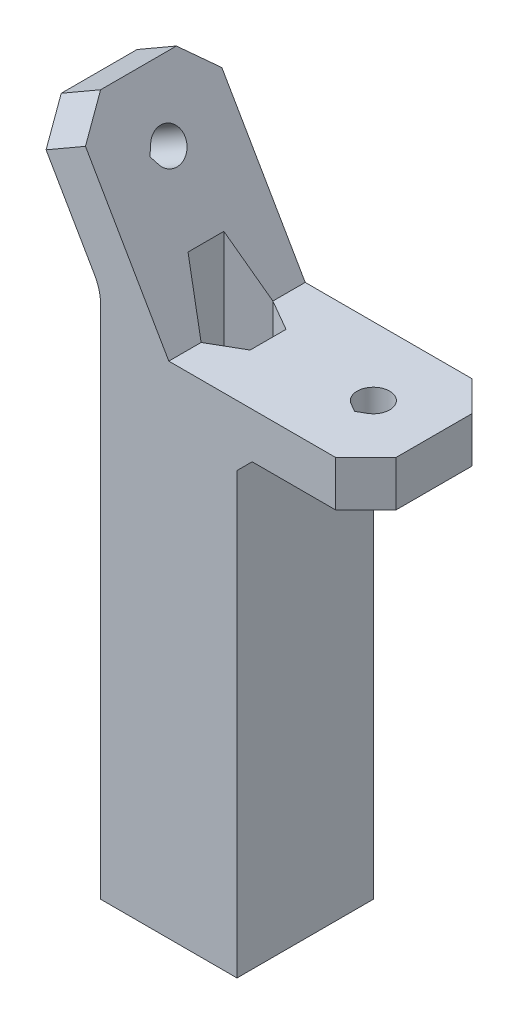
ISO-10303-21;
HEADER;
FILE_DESCRIPTION(('STEP AP214'),'2;1');
FILE_NAME('part.step','',(''),(''),'','','');
FILE_SCHEMA(('AUTOMOTIVE_DESIGN { 1 0 10303 214 1 1 1 1 }'));
ENDSEC;
DATA;
#1=APPLICATION_CONTEXT('core data for automotive mechanical design processes');
#2=APPLICATION_PROTOCOL_DEFINITION('international standard','automotive_design',2000,#1);
#3=PRODUCT_CONTEXT('',#1,'mechanical');
#4=PRODUCT('Part','Part','',(#3));
#5=PRODUCT_RELATED_PRODUCT_CATEGORY('part','',(#4));
#6=PRODUCT_DEFINITION_FORMATION('','',#4);
#7=PRODUCT_DEFINITION_CONTEXT('part definition',#1,'design');
#8=PRODUCT_DEFINITION('design','',#6,#7);
#9=PRODUCT_DEFINITION_SHAPE('','',#8);
#10=(LENGTH_UNIT() NAMED_UNIT(*) SI_UNIT(.MILLI.,.METRE.));
#11=(NAMED_UNIT(*) PLANE_ANGLE_UNIT() SI_UNIT($,.RADIAN.));
#12=(NAMED_UNIT(*) SI_UNIT($,.STERADIAN.) SOLID_ANGLE_UNIT());
#13=UNCERTAINTY_MEASURE_WITH_UNIT(LENGTH_MEASURE(1.E-05),#10,'distance_accuracy_value','');
#14=(GEOMETRIC_REPRESENTATION_CONTEXT(3) GLOBAL_UNCERTAINTY_ASSIGNED_CONTEXT((#13)) GLOBAL_UNIT_ASSIGNED_CONTEXT((#10,
#11,#12)) REPRESENTATION_CONTEXT('',''));
#15=CARTESIAN_POINT('',(0.,0.,0.));
#16=DIRECTION('',(0.,0.,1.));
#17=DIRECTION('',(1.,0.,0.));
#18=AXIS2_PLACEMENT_3D('',#15,#16,#17);
#19=CARTESIAN_POINT('',(3.46410161513776,28.5166604983954,0.));
#20=DIRECTION('',(0.,-1.,0.));
#21=DIRECTION('',(0.,0.,-1.));
#22=AXIS2_PLACEMENT_3D('',#19,#20,#21);
#23=CYLINDRICAL_SURFACE('',#22,2.65);
#24=DIRECTION('',(0.,-1.,0.));
#25=VECTOR('',#24,1.);
#26=CARTESIAN_POINT('',(2.13910161513777,28.5166604983954,2.29496732002876));
#27=LINE('',#26,#25);
#28=CARTESIAN_POINT('',(2.13910161513776,-54.,2.29496732002876));
#29=VERTEX_POINT('',#28);
#30=CARTESIAN_POINT('',(2.13910161513776,-60.,2.29496732002876));
#31=VERTEX_POINT('',#30);
#32=EDGE_CURVE('E253',#29,#31,#27,.T.);
#33=ORIENTED_EDGE('',*,*,#32,.T.);
#34=CARTESIAN_POINT('',(3.46410161513776,-60.,0.));
#35=DIRECTION('',(0.,-1.,0.));
#36=DIRECTION('',(0.,0.,-1.));
#37=AXIS2_PLACEMENT_3D('',#34,#35,#36);
#38=CIRCLE('',#37,2.65);
#39=CARTESIAN_POINT('',(4.78910161513777,-60.,2.29496732002876));
#40=VERTEX_POINT('',#39);
#41=EDGE_CURVE('E250',#31,#40,#38,.T.);
#42=ORIENTED_EDGE('',*,*,#41,.T.);
#43=DIRECTION('',(0.,-1.,0.));
#44=VECTOR('',#43,1.);
#45=CARTESIAN_POINT('',(4.78910161513777,28.5166604983954,2.29496732002876));
#46=LINE('',#45,#44);
#47=CARTESIAN_POINT('',(4.78910161513777,-54.,2.29496732002876));
#48=VERTEX_POINT('',#47);
#49=EDGE_CURVE('E234',#48,#40,#46,.T.);
#50=ORIENTED_EDGE('',*,*,#49,.F.);
#51=CARTESIAN_POINT('',(3.46410161513776,-54.,0.));
#52=DIRECTION('',(0.,-1.,0.));
#53=DIRECTION('',(0.,0.,-1.));
#54=AXIS2_PLACEMENT_3D('',#51,#52,#53);
#55=CIRCLE('',#54,2.65);
#56=EDGE_CURVE('E255',#48,#29,#55,.F.);
#57=ORIENTED_EDGE('',*,*,#56,.T.);
#58=EDGE_LOOP('',(#33,#42,#50,#57));
#59=FACE_BOUND('',#58,.T.);
#60=ADVANCED_FACE('F39',(#59),#23,.F.);
#61=CARTESIAN_POINT('',(21.4641016151378,0.,0.));
#62=DIRECTION('',(0.,1.,0.));
#63=DIRECTION('',(0.,0.,1.));
#64=AXIS2_PLACEMENT_3D('',#61,#62,#63);
#65=CYLINDRICAL_SURFACE('',#64,2.15);
#66=DIRECTION('',(0.,1.,0.));
#67=VECTOR('',#66,1.);
#68=CARTESIAN_POINT('',(22.5391016151378,0.,1.86195461813654));
#69=LINE('',#68,#67);
#70=CARTESIAN_POINT('',(22.5391016151378,6.,1.86195461813654));
#71=VERTEX_POINT('',#70);
#72=CARTESIAN_POINT('',(22.5391016151378,0.,1.86195461813654));
#73=VERTEX_POINT('',#72);
#74=EDGE_CURVE('E421',#71,#73,#69,.F.);
#75=ORIENTED_EDGE('',*,*,#74,.F.);
#76=CARTESIAN_POINT('',(21.4641016151378,6.,0.));
#77=DIRECTION('',(0.,1.,0.));
#78=DIRECTION('',(0.,0.,1.));
#79=AXIS2_PLACEMENT_3D('',#76,#77,#78);
#80=CIRCLE('',#79,2.15);
#81=CARTESIAN_POINT('',(20.3891016151378,6.,1.86195461813654));
#82=VERTEX_POINT('',#81);
#83=EDGE_CURVE('E314',#71,#82,#80,.T.);
#84=ORIENTED_EDGE('',*,*,#83,.T.);
#85=DIRECTION('',(0.,1.,0.));
#86=VECTOR('',#85,1.);
#87=CARTESIAN_POINT('',(20.3891016151378,0.,1.86195461813654));
#88=LINE('',#87,#86);
#89=CARTESIAN_POINT('',(20.3891016151378,0.,1.86195461813654));
#90=VERTEX_POINT('',#89);
#91=EDGE_CURVE('E418',#82,#90,#88,.F.);
#92=ORIENTED_EDGE('',*,*,#91,.T.);
#93=CARTESIAN_POINT('',(21.4641016151378,0.,0.));
#94=DIRECTION('',(0.,1.,0.));
#95=DIRECTION('',(0.,0.,1.));
#96=AXIS2_PLACEMENT_3D('',#93,#94,#95);
#97=CIRCLE('',#96,2.15);
#98=EDGE_CURVE('E315',#73,#90,#97,.T.);
#99=ORIENTED_EDGE('',*,*,#98,.F.);
#100=EDGE_LOOP('',(#75,#84,#92,#99));
#101=FACE_BOUND('',#100,.T.);
#102=ADVANCED_FACE('F509',(#101),#65,.F.);
#103=CARTESIAN_POINT('',(-21.7810889132455,12.2092921435211,0.));
#104=DIRECTION('',(0.86602540378444,0.499999999999998,0.));
#105=DIRECTION('',(-0.499999999999998,0.86602540378444,0.));
#106=AXIS2_PLACEMENT_3D('',#103,#104,#105);
#107=CYLINDRICAL_SURFACE('',#106,2.15);
#108=DIRECTION('',(0.86602540378444,0.499999999999998,0.));
#109=VECTOR('',#108,1.);
#110=CARTESIAN_POINT('',(-21.2435889132455,11.2783148344528,1.86195461813654));
#111=LINE('',#110,#109);
#112=CARTESIAN_POINT('',(-4.9983983848622,20.6574799590516,1.86195461813654));
#113=VERTEX_POINT('',#112);
#114=CARTESIAN_POINT('',(-10.1945508075688,17.6574799590516,1.86195461813654));
#115=VERTEX_POINT('',#114);
#116=EDGE_CURVE('E416',#113,#115,#111,.F.);
#117=ORIENTED_EDGE('',*,*,#116,.F.);
#118=CARTESIAN_POINT('',(-5.5358983848622,21.5884572681199,0.));
#119=DIRECTION('',(0.86602540378444,0.499999999999998,0.));
#120=DIRECTION('',(-0.499999999999998,0.86602540378444,0.));
#121=AXIS2_PLACEMENT_3D('',#118,#119,#120);
#122=CIRCLE('',#121,2.15);
#123=CARTESIAN_POINT('',(-6.0733983848622,22.5194345771882,1.86195461813654));
#124=VERTEX_POINT('',#123);
#125=EDGE_CURVE('E297',#113,#124,#122,.T.);
#126=ORIENTED_EDGE('',*,*,#125,.T.);
#127=DIRECTION('',(0.86602540378444,0.499999999999998,0.));
#128=VECTOR('',#127,1.);
#129=CARTESIAN_POINT('',(-22.3185889132455,13.1402694525894,1.86195461813654));
#130=LINE('',#129,#128);
#131=CARTESIAN_POINT('',(-11.2695508075688,19.5194345771882,1.86195461813654));
#132=VERTEX_POINT('',#131);
#133=EDGE_CURVE('E413',#124,#132,#130,.F.);
#134=ORIENTED_EDGE('',*,*,#133,.T.);
#135=CARTESIAN_POINT('',(-10.7320508075688,18.5884572681199,0.));
#136=DIRECTION('',(0.86602540378444,0.499999999999998,0.));
#137=DIRECTION('',(-0.499999999999998,0.86602540378444,0.));
#138=AXIS2_PLACEMENT_3D('',#135,#136,#137);
#139=CIRCLE('',#138,2.15);
#140=EDGE_CURVE('E311',#115,#132,#139,.T.);
#141=ORIENTED_EDGE('',*,*,#140,.F.);
#142=EDGE_LOOP('',(#117,#126,#134,#141));
#143=FACE_BOUND('',#142,.T.);
#144=ADVANCED_FACE('F514',(#143),#107,.F.);
#145=CARTESIAN_POINT('',(-14.7320508075688,25.5166604983955,9.));
#146=DIRECTION('',(0.499999999999995,-0.866025403784442,0.));
#147=DIRECTION('',(0.866025403784442,0.499999999999995,0.));
#148=AXIS2_PLACEMENT_3D('',#145,#146,#147);
#149=PLANE('',#148);
#150=DIRECTION('',(0.,0.,-1.));
#151=VECTOR('',#150,1.);
#152=CARTESIAN_POINT('',(-14.7320508075688,25.5166604983955,9.));
#153=LINE('',#152,#151);
#154=CARTESIAN_POINT('',(-14.7320508075688,25.5166604983955,5.00000000000001));
#155=VERTEX_POINT('',#154);
#156=CARTESIAN_POINT('',(-14.7320508075688,25.5166604983955,-5.));
#157=VERTEX_POINT('',#156);
#158=EDGE_CURVE('E354',#155,#157,#153,.T.);
#159=ORIENTED_EDGE('',*,*,#158,.F.);
#160=DIRECTION('',(0.866025403784442,0.499999999999995,0.));
#161=VECTOR('',#160,1.);
#162=CARTESIAN_POINT('',(-14.7320508075688,25.5166604983955,5.00000000000001));
#163=LINE('',#162,#161);
#164=CARTESIAN_POINT('',(-9.53589838486218,28.5166604983954,5.00000000000001));
#165=VERTEX_POINT('',#164);
#166=EDGE_CURVE('E370',#155,#165,#163,.T.);
#167=ORIENTED_EDGE('',*,*,#166,.T.);
#168=DIRECTION('',(0.,0.,-1.));
#169=VECTOR('',#168,1.);
#170=CARTESIAN_POINT('',(-9.53589838486218,28.5166604983954,9.));
#171=LINE('',#170,#169);
#172=CARTESIAN_POINT('',(-9.53589838486218,28.5166604983954,-5.));
#173=VERTEX_POINT('',#172);
#174=EDGE_CURVE('E332',#165,#173,#171,.T.);
#175=ORIENTED_EDGE('',*,*,#174,.T.);
#176=DIRECTION('',(-0.866025403784442,-0.499999999999995,0.));
#177=VECTOR('',#176,1.);
#178=CARTESIAN_POINT('',(-14.7320508075688,25.5166604983955,-5.));
#179=LINE('',#178,#177);
#180=EDGE_CURVE('E367',#173,#157,#179,.T.);
#181=ORIENTED_EDGE('',*,*,#180,.T.);
#182=EDGE_LOOP('',(#159,#167,#175,#181));
#183=FACE_BOUND('',#182,.T.);
#184=ADVANCED_FACE('F548',(#183),#149,.F.);
#185=CARTESIAN_POINT('',(-14.7320508075688,25.5166604983955,9.));
#186=DIRECTION('',(0.86602540378444,0.499999999999998,0.));
#187=DIRECTION('',(-0.499999999999998,0.86602540378444,0.));
#188=AXIS2_PLACEMENT_3D('',#185,#186,#187);
#189=PLANE('',#188);
#190=DIRECTION('',(0.433012701892217,-0.75,0.500000000000002));
#191=VECTOR('',#190,1.);
#192=CARTESIAN_POINT('',(-12.3209936490538,21.3405869998948,0.647853002998779));
#193=LINE('',#192,#191);
#194=CARTESIAN_POINT('',(-10.7320508075688,18.5884572681199,2.48260615751539));
#195=VERTEX_POINT('',#194);
#196=EDGE_CURVE('E282',#132,#195,#193,.T.);
#197=ORIENTED_EDGE('',*,*,#196,.T.);
#198=DIRECTION('',(0.433012701892217,-0.75,-0.500000000000001));
#199=VECTOR('',#198,1.);
#200=CARTESIAN_POINT('',(-15.1431079660838,26.2286323817583,7.57605623327432));
#201=LINE('',#200,#199);
#202=EDGE_CURVE('E285',#195,#115,#201,.T.);
#203=ORIENTED_EDGE('',*,*,#202,.T.);
#204=ORIENTED_EDGE('',*,*,#140,.T.);
#205=EDGE_LOOP('',(#197,#203,#204));
#206=FACE_BOUND('',#205,.T.);
#207=DIRECTION('',(0.499999999999998,-0.86602540378444,0.));
#208=VECTOR('',#207,1.);
#209=CARTESIAN_POINT('',(-14.7320508075688,25.5166604983955,-9.));
#210=LINE('',#209,#208);
#211=CARTESIAN_POINT('',(-12.7320508075688,22.0525588832577,-9.));
#212=VERTEX_POINT('',#211);
#213=CARTESIAN_POINT('',(-6.3397459621556,10.9807621135332,-9.));
#214=VERTEX_POINT('',#213);
#215=EDGE_CURVE('E318',#212,#214,#210,.T.);
#216=ORIENTED_EDGE('',*,*,#215,.T.);
#217=DIRECTION('',(0.,0.,-1.));
#218=VECTOR('',#217,1.);
#219=CARTESIAN_POINT('',(-6.3397459621556,10.9807621135332,9.));
#220=LINE('',#219,#218);
#221=CARTESIAN_POINT('',(-6.3397459621556,10.9807621135332,9.));
#222=VERTEX_POINT('',#221);
#223=EDGE_CURVE('E407',#214,#222,#220,.F.);
#224=ORIENTED_EDGE('',*,*,#223,.T.);
#225=DIRECTION('',(0.499999999999998,-0.86602540378444,0.));
#226=VECTOR('',#225,1.);
#227=CARTESIAN_POINT('',(-14.7320508075688,25.5166604983955,9.));
#228=LINE('',#227,#226);
#229=CARTESIAN_POINT('',(-12.7320508075689,22.0525588832577,9.));
#230=VERTEX_POINT('',#229);
#231=EDGE_CURVE('E321',#230,#222,#228,.T.);
#232=ORIENTED_EDGE('',*,*,#231,.F.);
#233=DIRECTION('',(0.353553390593272,-0.612372435695794,0.707106781186549));
#234=VECTOR('',#233,1.);
#235=CARTESIAN_POINT('',(-12.7320508075689,22.0525588832577,9.));
#236=LINE('',#235,#234);
#237=EDGE_CURVE('E365',#230,#155,#236,.F.);
#238=ORIENTED_EDGE('',*,*,#237,.T.);
#239=ORIENTED_EDGE('',*,*,#158,.T.);
#240=DIRECTION('',(0.353553390593273,-0.612372435695796,-0.707106781186547));
#241=VECTOR('',#240,1.);
#242=CARTESIAN_POINT('',(-14.7320508075688,25.5166604983955,-5.));
#243=LINE('',#242,#241);
#244=EDGE_CURVE('E363',#157,#212,#243,.T.);
#245=ORIENTED_EDGE('',*,*,#244,.T.);
#246=EDGE_LOOP('',(#216,#224,#232,#238,#239,#245));
#247=FACE_BOUND('',#246,.T.);
#248=ADVANCED_FACE('F571',(#206,#247),#189,.F.);
#249=CARTESIAN_POINT('',(0.,0.,9.));
#250=DIRECTION('',(0.,1.,0.));
#251=DIRECTION('',(0.,0.,1.));
#252=AXIS2_PLACEMENT_3D('',#249,#250,#251);
#253=PLANE('',#252);
#254=DIRECTION('',(0.86602540378444,0.,0.499999999999997));
#255=VECTOR('',#254,1.);
#256=CARTESIAN_POINT('',(8.18813972081435,0.,-5.1822740159234));
#257=LINE('',#256,#255);
#258=CARTESIAN_POINT('',(21.4641016151378,0.,2.48260615751539));
#259=VERTEX_POINT('',#258);
#260=EDGE_CURVE('E269',#90,#259,#257,.T.);
#261=ORIENTED_EDGE('',*,*,#260,.T.);
#262=DIRECTION('',(0.866025403784437,0.,-0.500000000000003));
#263=VECTOR('',#262,1.);
#264=CARTESIAN_POINT('',(2.54391108675451,0.,13.4061832521965));
#265=LINE('',#264,#263);
#266=EDGE_CURVE('E272',#259,#73,#265,.T.);
#267=ORIENTED_EDGE('',*,*,#266,.T.);
#268=ORIENTED_EDGE('',*,*,#98,.T.);
#269=EDGE_LOOP('',(#261,#267,#268));
#270=FACE_BOUND('',#269,.T.);
#271=DIRECTION('',(1.,0.,0.));
#272=VECTOR('',#271,1.);
#273=CARTESIAN_POINT('',(0.,0.,9.));
#274=LINE('',#273,#272);
#275=CARTESIAN_POINT('',(14.4641016151378,0.,9.));
#276=VERTEX_POINT('',#275);
#277=CARTESIAN_POINT('',(25.4641016151378,0.,9.));
#278=VERTEX_POINT('',#277);
#279=EDGE_CURVE('E324',#276,#278,#274,.T.);
#280=ORIENTED_EDGE('',*,*,#279,.F.);
#281=DIRECTION('',(0.,0.,-1.));
#282=VECTOR('',#281,1.);
#283=CARTESIAN_POINT('',(14.4641016151378,0.,9.));
#284=LINE('',#283,#282);
#285=CARTESIAN_POINT('',(14.4641016151378,0.,-9.));
#286=VERTEX_POINT('',#285);
#287=EDGE_CURVE('E395',#276,#286,#284,.T.);
#288=ORIENTED_EDGE('',*,*,#287,.T.);
#289=DIRECTION('',(1.,0.,0.));
#290=VECTOR('',#289,1.);
#291=CARTESIAN_POINT('',(0.,0.,-9.));
#292=LINE('',#291,#290);
#293=CARTESIAN_POINT('',(25.4641016151378,0.,-9.));
#294=VERTEX_POINT('',#293);
#295=EDGE_CURVE('E335',#286,#294,#292,.T.);
#296=ORIENTED_EDGE('',*,*,#295,.T.);
#297=DIRECTION('',(0.707106781186548,0.,0.707106781186548));
#298=VECTOR('',#297,1.);
#299=CARTESIAN_POINT('',(29.4641016151378,0.,-5.));
#300=LINE('',#299,#298);
#301=CARTESIAN_POINT('',(29.4641016151378,0.,-5.));
#302=VERTEX_POINT('',#301);
#303=EDGE_CURVE('E393',#294,#302,#300,.T.);
#304=ORIENTED_EDGE('',*,*,#303,.T.);
#305=DIRECTION('',(0.,0.,-1.));
#306=VECTOR('',#305,1.);
#307=CARTESIAN_POINT('',(29.4641016151378,0.,9.));
#308=LINE('',#307,#306);
#309=CARTESIAN_POINT('',(29.4641016151378,0.,5.00000000000001));
#310=VERTEX_POINT('',#309);
#311=EDGE_CURVE('E351',#310,#302,#308,.T.);
#312=ORIENTED_EDGE('',*,*,#311,.F.);
#313=DIRECTION('',(0.707106781186546,0.,-0.707106781186549));
#314=VECTOR('',#313,1.);
#315=CARTESIAN_POINT('',(25.4641016151378,0.,9.));
#316=LINE('',#315,#314);
#317=EDGE_CURVE('E390',#310,#278,#316,.F.);
#318=ORIENTED_EDGE('',*,*,#317,.T.);
#319=EDGE_LOOP('',(#280,#288,#296,#304,#312,#318));
#320=FACE_BOUND('',#319,.T.);
#321=ADVANCED_FACE('F567',(#270,#320),#253,.F.);
#322=CARTESIAN_POINT('',(29.4641016151378,6.,9.));
#323=DIRECTION('',(-1.,0.,0.));
#324=DIRECTION('',(0.,0.,1.));
#325=AXIS2_PLACEMENT_3D('',#322,#323,#324);
#326=PLANE('',#325);
#327=ORIENTED_EDGE('',*,*,#311,.T.);
#328=DIRECTION('',(0.,1.,0.));
#329=VECTOR('',#328,1.);
#330=CARTESIAN_POINT('',(29.4641016151378,6.,-5.));
#331=LINE('',#330,#329);
#332=CARTESIAN_POINT('',(29.4641016151378,6.,-5.));
#333=VERTEX_POINT('',#332);
#334=EDGE_CURVE('E383',#302,#333,#331,.T.);
#335=ORIENTED_EDGE('',*,*,#334,.T.);
#336=DIRECTION('',(0.,0.,-1.));
#337=VECTOR('',#336,1.);
#338=CARTESIAN_POINT('',(29.4641016151378,6.,9.));
#339=LINE('',#338,#337);
#340=CARTESIAN_POINT('',(29.4641016151378,6.,5.00000000000001));
#341=VERTEX_POINT('',#340);
#342=EDGE_CURVE('E348',#341,#333,#339,.T.);
#343=ORIENTED_EDGE('',*,*,#342,.F.);
#344=DIRECTION('',(0.,-1.,0.));
#345=VECTOR('',#344,1.);
#346=CARTESIAN_POINT('',(29.4641016151378,6.,5.00000000000001));
#347=LINE('',#346,#345);
#348=EDGE_CURVE('E381',#341,#310,#347,.T.);
#349=ORIENTED_EDGE('',*,*,#348,.T.);
#350=EDGE_LOOP('',(#327,#335,#343,#349));
#351=FACE_BOUND('',#350,.T.);
#352=ADVANCED_FACE('F563',(#351),#326,.F.);
#353=CARTESIAN_POINT('',(3.46410161513776,6.,9.));
#354=DIRECTION('',(0.,-1.,0.));
#355=DIRECTION('',(0.,0.,-1.));
#356=AXIS2_PLACEMENT_3D('',#353,#354,#355);
#357=PLANE('',#356);
#358=ORIENTED_EDGE('',*,*,#83,.F.);
#359=DIRECTION('',(0.866025403784437,0.,-0.500000000000002));
#360=VECTOR('',#359,1.);
#361=CARTESIAN_POINT('',(22.5391016151378,6.,1.86195461813654));
#362=LINE('',#361,#360);
#363=CARTESIAN_POINT('',(21.4641016151378,6.,2.48260615751539));
#364=VERTEX_POINT('',#363);
#365=EDGE_CURVE('E258',#364,#71,#362,.T.);
#366=ORIENTED_EDGE('',*,*,#365,.F.);
#367=DIRECTION('',(0.86602540378444,0.,0.499999999999997));
#368=VECTOR('',#367,1.);
#369=CARTESIAN_POINT('',(21.4641016151378,6.,2.48260615751539));
#370=LINE('',#369,#368);
#371=EDGE_CURVE('E254',#82,#364,#370,.T.);
#372=ORIENTED_EDGE('',*,*,#371,.F.);
#373=EDGE_LOOP('',(#358,#366,#372));
#374=FACE_BOUND('',#373,.T.);
#375=DIRECTION('',(0.,0.,1.));
#376=VECTOR('',#375,1.);
#377=CARTESIAN_POINT('',(7.56410161513776,6.,9.));
#378=LINE('',#377,#376);
#379=CARTESIAN_POINT('',(7.56410161513776,6.,-2.36713610367747));
#380=VERTEX_POINT('',#379);
#381=CARTESIAN_POINT('',(7.56410161513776,6.,2.36713610367747));
#382=VERTEX_POINT('',#381);
#383=EDGE_CURVE('E435',#380,#382,#378,.T.);
#384=ORIENTED_EDGE('',*,*,#383,.T.);
#385=DIRECTION('',(-0.866025403784439,0.,0.5));
#386=VECTOR('',#385,1.);
#387=CARTESIAN_POINT('',(1.61698729810779,6.,5.8007041555162));
#388=LINE('',#387,#386);
#389=CARTESIAN_POINT('',(3.46410161513776,5.99999999999999,4.73427220735493));
#390=VERTEX_POINT('',#389);
#391=EDGE_CURVE('E438',#382,#390,#388,.T.);
#392=ORIENTED_EDGE('',*,*,#391,.T.);
#393=DIRECTION('',(0.,0.,-1.));
#394=VECTOR('',#393,1.);
#395=CARTESIAN_POINT('',(3.46410161513776,6.,9.));
#396=LINE('',#395,#394);
#397=CARTESIAN_POINT('',(3.46410161513776,6.,9.));
#398=VERTEX_POINT('',#397);
#399=EDGE_CURVE('E345',#398,#390,#396,.T.);
#400=ORIENTED_EDGE('',*,*,#399,.F.);
#401=DIRECTION('',(-1.,0.,0.));
#402=VECTOR('',#401,1.);
#403=CARTESIAN_POINT('',(3.46410161513776,6.,9.));
#404=LINE('',#403,#402);
#405=CARTESIAN_POINT('',(25.4641016151378,6.,9.));
#406=VERTEX_POINT('',#405);
#407=EDGE_CURVE('E327',#406,#398,#404,.T.);
#408=ORIENTED_EDGE('',*,*,#407,.F.);
#409=DIRECTION('',(-0.707106781186546,0.,0.707106781186549));
#410=VECTOR('',#409,1.);
#411=CARTESIAN_POINT('',(25.4641016151378,6.,9.));
#412=LINE('',#411,#410);
#413=EDGE_CURVE('E386',#406,#341,#412,.F.);
#414=ORIENTED_EDGE('',*,*,#413,.T.);
#415=ORIENTED_EDGE('',*,*,#342,.T.);
#416=DIRECTION('',(-0.707106781186548,0.,-0.707106781186548));
#417=VECTOR('',#416,1.);
#418=CARTESIAN_POINT('',(29.4641016151378,6.,-5.));
#419=LINE('',#418,#417);
#420=CARTESIAN_POINT('',(25.4641016151378,6.,-9.));
#421=VERTEX_POINT('',#420);
#422=EDGE_CURVE('E388',#333,#421,#419,.T.);
#423=ORIENTED_EDGE('',*,*,#422,.T.);
#424=DIRECTION('',(-1.,0.,0.));
#425=VECTOR('',#424,1.);
#426=CARTESIAN_POINT('',(3.46410161513776,6.,-9.));
#427=LINE('',#426,#425);
#428=CARTESIAN_POINT('',(3.46410161513776,6.,-9.));
#429=VERTEX_POINT('',#428);
#430=EDGE_CURVE('E337',#421,#429,#427,.T.);
#431=ORIENTED_EDGE('',*,*,#430,.T.);
#432=CARTESIAN_POINT('',(3.46410161513776,6.00000000000001,-4.73427220735493));
#433=VERTEX_POINT('',#432);
#434=EDGE_CURVE('E344',#433,#429,#396,.T.);
#435=ORIENTED_EDGE('',*,*,#434,.F.);
#436=DIRECTION('',(0.866025403784439,0.,0.5));
#437=VECTOR('',#436,1.);
#438=CARTESIAN_POINT('',(9.41121593216773,6.,-1.3007041555162));
#439=LINE('',#438,#437);
#440=EDGE_CURVE('E432',#433,#380,#439,.T.);
#441=ORIENTED_EDGE('',*,*,#440,.T.);
#442=EDGE_LOOP('',(#384,#392,#400,#408,#414,#415,#423,#431,#435,#441));
#443=FACE_BOUND('',#442,.T.);
#444=ADVANCED_FACE('F487',(#374,#443),#357,.F.);
#445=CARTESIAN_POINT('',(-9.53589838486218,28.5166604983954,9.));
#446=DIRECTION('',(-0.86602540378444,-0.499999999999998,0.));
#447=DIRECTION('',(0.499999999999998,-0.86602540378444,0.));
#448=AXIS2_PLACEMENT_3D('',#445,#446,#447);
#449=PLANE('',#448);
#450=ORIENTED_EDGE('',*,*,#125,.F.);
#451=DIRECTION('',(0.433012701892218,-0.75,-0.500000000000001));
#452=VECTOR('',#451,1.);
#453=CARTESIAN_POINT('',(-5.5358983848622,21.5884572681199,2.48260615751539));
#454=LINE('',#453,#452);
#455=CARTESIAN_POINT('',(-5.5358983848622,21.5884572681199,2.48260615751539));
#456=VERTEX_POINT('',#455);
#457=EDGE_CURVE('E278',#456,#113,#454,.T.);
#458=ORIENTED_EDGE('',*,*,#457,.F.);
#459=DIRECTION('',(0.433012701892216,-0.750000000000001,0.500000000000002));
#460=VECTOR('',#459,1.);
#461=CARTESIAN_POINT('',(-6.0733983848622,22.5194345771882,1.86195461813654));
#462=LINE('',#461,#460);
#463=EDGE_CURVE('E275',#124,#456,#462,.T.);
#464=ORIENTED_EDGE('',*,*,#463,.F.);
#465=EDGE_LOOP('',(#450,#458,#464));
#466=FACE_BOUND('',#465,.T.);
#467=DIRECTION('',(0.,0.,-1.));
#468=VECTOR('',#467,1.);
#469=CARTESIAN_POINT('',(-0.635898384862239,13.1014083110324,9.));
#470=LINE('',#469,#468);
#471=CARTESIAN_POINT('',(-0.635898384862238,13.1014083110324,2.36713610367747));
#472=VERTEX_POINT('',#471);
#473=CARTESIAN_POINT('',(-0.635898384862239,13.1014083110324,-2.36713610367746));
#474=VERTEX_POINT('',#473);
#475=EDGE_CURVE('E426',#472,#474,#470,.T.);
#476=ORIENTED_EDGE('',*,*,#475,.T.);
#477=DIRECTION('',(0.48038446141526,-0.832050294337845,-0.277350098112614));
#478=VECTOR('',#477,1.);
#479=CARTESIAN_POINT('',(-10.3657797131791,29.9540571232931,3.25041350040939));
#480=LINE('',#479,#478);
#481=EDGE_CURVE('E429',#474,#433,#480,.T.);
#482=ORIENTED_EDGE('',*,*,#481,.T.);
#483=ORIENTED_EDGE('',*,*,#434,.T.);
#484=DIRECTION('',(-0.499999999999998,0.86602540378444,0.));
#485=VECTOR('',#484,1.);
#486=CARTESIAN_POINT('',(-9.53589838486218,28.5166604983954,-9.));
#487=LINE('',#486,#485);
#488=CARTESIAN_POINT('',(-7.53589838486219,25.0525588832577,-9.));
#489=VERTEX_POINT('',#488);
#490=EDGE_CURVE('E325',#429,#489,#487,.T.);
#491=ORIENTED_EDGE('',*,*,#490,.T.);
#492=DIRECTION('',(-0.353553390593273,0.612372435695796,0.707106781186547));
#493=VECTOR('',#492,1.);
#494=CARTESIAN_POINT('',(-9.53589838486219,28.5166604983954,-4.99999999999998));
#495=LINE('',#494,#493);
#496=EDGE_CURVE('E372',#489,#173,#495,.T.);
#497=ORIENTED_EDGE('',*,*,#496,.T.);
#498=ORIENTED_EDGE('',*,*,#174,.F.);
#499=DIRECTION('',(-0.353553390593272,0.612372435695794,-0.707106781186549));
#500=VECTOR('',#499,1.);
#501=CARTESIAN_POINT('',(-7.53589838486221,25.0525588832577,8.99999999999999));
#502=LINE('',#501,#500);
#503=CARTESIAN_POINT('',(-7.53589838486221,25.0525588832577,9.));
#504=VERTEX_POINT('',#503);
#505=EDGE_CURVE('E374',#165,#504,#502,.F.);
#506=ORIENTED_EDGE('',*,*,#505,.T.);
#507=DIRECTION('',(-0.499999999999998,0.86602540378444,0.));
#508=VECTOR('',#507,1.);
#509=CARTESIAN_POINT('',(-9.53589838486218,28.5166604983954,9.));
#510=LINE('',#509,#508);
#511=EDGE_CURVE('E329',#398,#504,#510,.T.);
#512=ORIENTED_EDGE('',*,*,#511,.F.);
#513=ORIENTED_EDGE('',*,*,#399,.T.);
#514=DIRECTION('',(-0.48038446141526,0.832050294337845,-0.277350098112613));
#515=VECTOR('',#514,1.);
#516=CARTESIAN_POINT('',(-7.96755551808375,25.8002109694469,-1.86579811579401));
#517=LINE('',#516,#515);
#518=EDGE_CURVE('E422',#390,#472,#517,.T.);
#519=ORIENTED_EDGE('',*,*,#518,.T.);
#520=EDGE_LOOP('',(#476,#482,#483,#491,#497,#498,#506,#512,#513,#519));
#521=FACE_BOUND('',#520,.T.);
#522=ADVANCED_FACE('F498',(#466,#521),#449,.F.);
#523=CARTESIAN_POINT('',(0.,0.,9.));
#524=DIRECTION('',(0.,0.,-1.));
#525=DIRECTION('',(-1.,0.,0.));
#526=AXIS2_PLACEMENT_3D('',#523,#524,#525);
#527=PLANE('',#526);
#528=ORIENTED_EDGE('',*,*,#511,.T.);
#529=DIRECTION('',(-0.866025403784442,-0.499999999999995,0.));
#530=VECTOR('',#529,1.);
#531=CARTESIAN_POINT('',(-12.7320508075688,22.0525588832578,9.));
#532=LINE('',#531,#530);
#533=EDGE_CURVE('E360',#504,#230,#532,.T.);
#534=ORIENTED_EDGE('',*,*,#533,.T.);
#535=ORIENTED_EDGE('',*,*,#231,.T.);
#536=CARTESIAN_POINT('',(-11.5358983848622,7.9807621135332,8.99999999999999));
#537=DIRECTION('',(0.,0.,-1.));
#538=DIRECTION('',(-1.,0.,0.));
#539=AXIS2_PLACEMENT_3D('',#536,#537,#538);
#540=CIRCLE('',#539,6.);
#541=CARTESIAN_POINT('',(-5.53589838486224,7.9807621135332,8.99999999999999));
#542=VERTEX_POINT('',#541);
#543=EDGE_CURVE('E411',#222,#542,#540,.T.);
#544=ORIENTED_EDGE('',*,*,#543,.T.);
#545=DIRECTION('',(0.,-1.,0.));
#546=VECTOR('',#545,1.);
#547=CARTESIAN_POINT('',(-5.53589838486225,-60.,8.99999999999999));
#548=LINE('',#547,#546);
#549=CARTESIAN_POINT('',(-5.53589838486224,-60.,8.99999999999999));
#550=VERTEX_POINT('',#549);
#551=EDGE_CURVE('E295',#542,#550,#548,.T.);
#552=ORIENTED_EDGE('',*,*,#551,.T.);
#553=DIRECTION('',(1.,0.,0.));
#554=VECTOR('',#553,1.);
#555=CARTESIAN_POINT('',(12.4641016151378,-60.,8.99999999999999));
#556=LINE('',#555,#554);
#557=CARTESIAN_POINT('',(12.4641016151378,-60.,8.99999999999999));
#558=VERTEX_POINT('',#557);
#559=EDGE_CURVE('E292',#550,#558,#556,.T.);
#560=ORIENTED_EDGE('',*,*,#559,.T.);
#561=DIRECTION('',(0.,1.,0.));
#562=VECTOR('',#561,1.);
#563=CARTESIAN_POINT('',(12.4641016151378,0.,8.99999999999999));
#564=LINE('',#563,#562);
#565=CARTESIAN_POINT('',(12.4641016151378,-1.99999999999999,8.99999999999999));
#566=VERTEX_POINT('',#565);
#567=EDGE_CURVE('E289',#558,#566,#564,.T.);
#568=ORIENTED_EDGE('',*,*,#567,.T.);
#569=DIRECTION('',(0.707106781186552,0.707106781186543,0.));
#570=VECTOR('',#569,1.);
#571=CARTESIAN_POINT('',(7.23205080756879,-7.23205080756889,9.));
#572=LINE('',#571,#570);
#573=EDGE_CURVE('E402',#566,#276,#572,.T.);
#574=ORIENTED_EDGE('',*,*,#573,.T.);
#575=ORIENTED_EDGE('',*,*,#279,.T.);
#576=DIRECTION('',(0.,1.,0.));
#577=VECTOR('',#576,1.);
#578=CARTESIAN_POINT('',(25.4641016151378,0.,9.));
#579=LINE('',#578,#577);
#580=EDGE_CURVE('E357',#278,#406,#579,.T.);
#581=ORIENTED_EDGE('',*,*,#580,.T.);
#582=ORIENTED_EDGE('',*,*,#407,.T.);
#583=EDGE_LOOP('',(#528,#534,#535,#544,#552,#560,#568,#574,#575,#581,#582));
#584=FACE_BOUND('',#583,.T.);
#585=ADVANCED_FACE('F551',(#584),#527,.F.);
#586=CARTESIAN_POINT('',(0.,0.,-9.));
#587=DIRECTION('',(0.,0.,-1.));
#588=DIRECTION('',(-1.,0.,0.));
#589=AXIS2_PLACEMENT_3D('',#586,#587,#588);
#590=PLANE('',#589);
#591=ORIENTED_EDGE('',*,*,#215,.F.);
#592=DIRECTION('',(0.866025403784442,0.499999999999995,0.));
#593=VECTOR('',#592,1.);
#594=CARTESIAN_POINT('',(-7.5358983848622,25.0525588832577,-9.));
#595=LINE('',#594,#593);
#596=EDGE_CURVE('E379',#212,#489,#595,.T.);
#597=ORIENTED_EDGE('',*,*,#596,.T.);
#598=ORIENTED_EDGE('',*,*,#490,.F.);
#599=ORIENTED_EDGE('',*,*,#430,.F.);
#600=DIRECTION('',(0.,-1.,0.));
#601=VECTOR('',#600,1.);
#602=CARTESIAN_POINT('',(25.4641016151378,0.,-9.));
#603=LINE('',#602,#601);
#604=EDGE_CURVE('E376',#421,#294,#603,.T.);
#605=ORIENTED_EDGE('',*,*,#604,.T.);
#606=ORIENTED_EDGE('',*,*,#295,.F.);
#607=DIRECTION('',(-0.707106781186552,-0.707106781186543,0.));
#608=VECTOR('',#607,1.);
#609=CARTESIAN_POINT('',(14.4641016151378,0.,-9.));
#610=LINE('',#609,#608);
#611=CARTESIAN_POINT('',(12.4641016151378,-1.99999999999999,-9.));
#612=VERTEX_POINT('',#611);
#613=EDGE_CURVE('E400',#286,#612,#610,.T.);
#614=ORIENTED_EDGE('',*,*,#613,.T.);
#615=DIRECTION('',(0.,-1.,0.));
#616=VECTOR('',#615,1.);
#617=CARTESIAN_POINT('',(12.4641016151378,0.,-9.));
#618=LINE('',#617,#616);
#619=CARTESIAN_POINT('',(12.4641016151378,-60.,-9.));
#620=VERTEX_POINT('',#619);
#621=EDGE_CURVE('E288',#612,#620,#618,.T.);
#622=ORIENTED_EDGE('',*,*,#621,.T.);
#623=DIRECTION('',(-1.,0.,0.));
#624=VECTOR('',#623,1.);
#625=CARTESIAN_POINT('',(12.4641016151378,-60.,-9.));
#626=LINE('',#625,#624);
#627=CARTESIAN_POINT('',(-5.53589838486225,-60.,-9.));
#628=VERTEX_POINT('',#627);
#629=EDGE_CURVE('E299',#620,#628,#626,.T.);
#630=ORIENTED_EDGE('',*,*,#629,.T.);
#631=DIRECTION('',(0.,1.,0.));
#632=VECTOR('',#631,1.);
#633=CARTESIAN_POINT('',(-5.53589838486225,-60.,-9.));
#634=LINE('',#633,#632);
#635=CARTESIAN_POINT('',(-5.53589838486224,7.9807621135332,-9.));
#636=VERTEX_POINT('',#635);
#637=EDGE_CURVE('E302',#628,#636,#634,.T.);
#638=ORIENTED_EDGE('',*,*,#637,.T.);
#639=CARTESIAN_POINT('',(-11.5358983848622,7.9807621135332,-8.99999999999999));
#640=DIRECTION('',(0.,0.,-1.));
#641=DIRECTION('',(-1.,0.,0.));
#642=AXIS2_PLACEMENT_3D('',#639,#640,#641);
#643=CIRCLE('',#642,6.);
#644=EDGE_CURVE('E409',#636,#214,#643,.F.);
#645=ORIENTED_EDGE('',*,*,#644,.T.);
#646=EDGE_LOOP('',(#591,#597,#598,#599,#605,#606,#614,#622,#630,#638,#645));
#647=FACE_BOUND('',#646,.T.);
#648=ADVANCED_FACE('F538',(#647),#590,.T.);
#649=CARTESIAN_POINT('',(-5.53589838486225,-60.,80.8787408414823));
#650=DIRECTION('',(-1.,0.,0.));
#651=DIRECTION('',(0.,-1.,0.));
#652=AXIS2_PLACEMENT_3D('',#649,#650,#651);
#653=PLANE('',#652);
#654=ORIENTED_EDGE('',*,*,#551,.F.);
#655=DIRECTION('',(0.,0.,-1.));
#656=VECTOR('',#655,1.);
#657=CARTESIAN_POINT('',(-5.53589838486224,7.9807621135332,80.8787408414823));
#658=LINE('',#657,#656);
#659=EDGE_CURVE('E404',#542,#636,#658,.T.);
#660=ORIENTED_EDGE('',*,*,#659,.T.);
#661=ORIENTED_EDGE('',*,*,#637,.F.);
#662=DIRECTION('',(0.,0.,-1.));
#663=VECTOR('',#662,1.);
#664=CARTESIAN_POINT('',(-5.53589838486225,-60.,80.8787408414823));
#665=LINE('',#664,#663);
#666=EDGE_CURVE('E293',#550,#628,#665,.T.);
#667=ORIENTED_EDGE('',*,*,#666,.F.);
#668=EDGE_LOOP('',(#654,#660,#661,#667));
#669=FACE_BOUND('',#668,.T.);
#670=ADVANCED_FACE('F535',(#669),#653,.T.);
#671=CARTESIAN_POINT('',(12.4641016151378,-60.,80.8787408414823));
#672=DIRECTION('',(0.,-1.,0.));
#673=DIRECTION('',(0.,0.,-1.));
#674=AXIS2_PLACEMENT_3D('',#671,#672,#673);
#675=PLANE('',#674);
#676=DIRECTION('',(-0.866025403784439,0.,-0.5));
#677=VECTOR('',#676,1.);
#678=CARTESIAN_POINT('',(2.13910161513776,-60.,2.29496732002876));
#679=LINE('',#678,#677);
#680=CARTESIAN_POINT('',(3.46410161513776,-60.,3.05995642670502));
#681=VERTEX_POINT('',#680);
#682=EDGE_CURVE('E244',#681,#31,#679,.T.);
#683=ORIENTED_EDGE('',*,*,#682,.F.);
#684=DIRECTION('',(-0.866025403784437,0.,0.500000000000002));
#685=VECTOR('',#684,1.);
#686=CARTESIAN_POINT('',(3.46410161513776,-60.,3.05995642670502));
#687=LINE('',#686,#685);
#688=EDGE_CURVE('E237',#40,#681,#687,.T.);
#689=ORIENTED_EDGE('',*,*,#688,.F.);
#690=ORIENTED_EDGE('',*,*,#41,.F.);
#691=EDGE_LOOP('',(#683,#689,#690));
#692=FACE_BOUND('',#691,.T.);
#693=ORIENTED_EDGE('',*,*,#559,.F.);
#694=ORIENTED_EDGE('',*,*,#666,.T.);
#695=ORIENTED_EDGE('',*,*,#629,.F.);
#696=DIRECTION('',(0.,0.,-1.));
#697=VECTOR('',#696,1.);
#698=CARTESIAN_POINT('',(12.4641016151378,-60.,80.8787408414823));
#699=LINE('',#698,#697);
#700=EDGE_CURVE('E305',#558,#620,#699,.T.);
#701=ORIENTED_EDGE('',*,*,#700,.F.);
#702=EDGE_LOOP('',(#693,#694,#695,#701));
#703=FACE_BOUND('',#702,.T.);
#704=ADVANCED_FACE('F248',(#692,#703),#675,.T.);
#705=CARTESIAN_POINT('',(12.4641016151378,0.,80.8787408414823));
#706=DIRECTION('',(1.,0.,0.));
#707=DIRECTION('',(0.,1.,0.));
#708=AXIS2_PLACEMENT_3D('',#705,#706,#707);
#709=PLANE('',#708);
#710=ORIENTED_EDGE('',*,*,#621,.F.);
#711=DIRECTION('',(0.,0.,1.));
#712=VECTOR('',#711,1.);
#713=CARTESIAN_POINT('',(12.4641016151378,-1.99999999999999,80.8787408414823));
#714=LINE('',#713,#712);
#715=EDGE_CURVE('E398',#612,#566,#714,.T.);
#716=ORIENTED_EDGE('',*,*,#715,.T.);
#717=ORIENTED_EDGE('',*,*,#567,.F.);
#718=ORIENTED_EDGE('',*,*,#700,.T.);
#719=EDGE_LOOP('',(#710,#716,#717,#718));
#720=FACE_BOUND('',#719,.T.);
#721=ADVANCED_FACE('F542',(#720),#709,.T.);
#722=CARTESIAN_POINT('',(-12.7320508075688,22.0525588832578,9.));
#723=DIRECTION('',(0.353553390593271,-0.612372435695798,-0.707106781186546));
#724=DIRECTION('',(-0.866025403784442,-0.499999999999995,0.));
#725=AXIS2_PLACEMENT_3D('',#722,#723,#724);
#726=PLANE('',#725);
#727=ORIENTED_EDGE('',*,*,#505,.F.);
#728=ORIENTED_EDGE('',*,*,#166,.F.);
#729=ORIENTED_EDGE('',*,*,#237,.F.);
#730=ORIENTED_EDGE('',*,*,#533,.F.);
#731=EDGE_LOOP('',(#727,#728,#729,#730));
#732=FACE_BOUND('',#731,.T.);
#733=ADVANCED_FACE('F545',(#732),#726,.F.);
#734=CARTESIAN_POINT('',(-14.7320508075688,25.5166604983955,-5.));
#735=DIRECTION('',(-0.35355339059327,0.612372435695796,-0.707106781186548));
#736=DIRECTION('',(0.866025403784442,0.499999999999995,0.));
#737=AXIS2_PLACEMENT_3D('',#734,#735,#736);
#738=PLANE('',#737);
#739=ORIENTED_EDGE('',*,*,#496,.F.);
#740=ORIENTED_EDGE('',*,*,#596,.F.);
#741=ORIENTED_EDGE('',*,*,#244,.F.);
#742=ORIENTED_EDGE('',*,*,#180,.F.);
#743=EDGE_LOOP('',(#739,#740,#741,#742));
#744=FACE_BOUND('',#743,.T.);
#745=ADVANCED_FACE('F585',(#744),#738,.T.);
#746=CARTESIAN_POINT('',(29.4641016151378,6.,-5.));
#747=DIRECTION('',(0.707106781186547,0.,-0.707106781186547));
#748=DIRECTION('',(0.,-1.,0.));
#749=AXIS2_PLACEMENT_3D('',#746,#747,#748);
#750=PLANE('',#749);
#751=ORIENTED_EDGE('',*,*,#303,.F.);
#752=ORIENTED_EDGE('',*,*,#604,.F.);
#753=ORIENTED_EDGE('',*,*,#422,.F.);
#754=ORIENTED_EDGE('',*,*,#334,.F.);
#755=EDGE_LOOP('',(#751,#752,#753,#754));
#756=FACE_BOUND('',#755,.T.);
#757=ADVANCED_FACE('F592',(#756),#750,.T.);
#758=CARTESIAN_POINT('',(25.4641016151378,0.,9.));
#759=DIRECTION('',(-0.707106781186549,0.,-0.707106781186546));
#760=DIRECTION('',(0.,1.,0.));
#761=AXIS2_PLACEMENT_3D('',#758,#759,#760);
#762=PLANE('',#761);
#763=ORIENTED_EDGE('',*,*,#317,.F.);
#764=ORIENTED_EDGE('',*,*,#348,.F.);
#765=ORIENTED_EDGE('',*,*,#413,.F.);
#766=ORIENTED_EDGE('',*,*,#580,.F.);
#767=EDGE_LOOP('',(#763,#764,#765,#766));
#768=FACE_BOUND('',#767,.T.);
#769=ADVANCED_FACE('F599',(#768),#762,.F.);
#770=CARTESIAN_POINT('',(14.4641016151378,0.,9.));
#771=DIRECTION('',(-0.707106781186543,0.707106781186552,0.));
#772=DIRECTION('',(0.,0.,-1.));
#773=AXIS2_PLACEMENT_3D('',#770,#771,#772);
#774=PLANE('',#773);
#775=ORIENTED_EDGE('',*,*,#573,.F.);
#776=ORIENTED_EDGE('',*,*,#715,.F.);
#777=ORIENTED_EDGE('',*,*,#613,.F.);
#778=ORIENTED_EDGE('',*,*,#287,.F.);
#779=EDGE_LOOP('',(#775,#776,#777,#778));
#780=FACE_BOUND('',#779,.T.);
#781=ADVANCED_FACE('F605',(#780),#774,.F.);
#782=CARTESIAN_POINT('',(-11.5358983848622,7.9807621135332,80.8787408414823));
#783=DIRECTION('',(0.,0.,-1.));
#784=DIRECTION('',(-1.,0.,0.));
#785=AXIS2_PLACEMENT_3D('',#782,#783,#784);
#786=CYLINDRICAL_SURFACE('',#785,6.);
#787=ORIENTED_EDGE('',*,*,#543,.F.);
#788=ORIENTED_EDGE('',*,*,#223,.F.);
#789=ORIENTED_EDGE('',*,*,#644,.F.);
#790=ORIENTED_EDGE('',*,*,#659,.F.);
#791=EDGE_LOOP('',(#787,#788,#789,#790));
#792=FACE_BOUND('',#791,.T.);
#793=ADVANCED_FACE('F41',(#792),#786,.F.);
#794=CARTESIAN_POINT('',(-47.7618510267786,-2.79070785647878,2.48260615751539));
#795=DIRECTION('',(0.25,-0.433012701892221,0.866025403784438));
#796=DIRECTION('',(0.,-0.894427190999915,-0.44721359549996));
#797=AXIS2_PLACEMENT_3D('',#794,#795,#796);
#798=PLANE('',#797);
#799=DIRECTION('',(0.86602540378444,0.499999999999998,0.));
#800=VECTOR('',#799,1.);
#801=CARTESIAN_POINT('',(-47.7618510267786,-2.79070785647878,2.48260615751539));
#802=LINE('',#801,#800);
#803=EDGE_CURVE('E280',#195,#456,#802,.T.);
#804=ORIENTED_EDGE('',*,*,#803,.T.);
#805=ORIENTED_EDGE('',*,*,#457,.T.);
#806=ORIENTED_EDGE('',*,*,#116,.T.);
#807=ORIENTED_EDGE('',*,*,#202,.F.);
#808=EDGE_LOOP('',(#804,#805,#806,#807));
#809=FACE_BOUND('',#808,.T.);
#810=ADVANCED_FACE('F528',(#809),#798,.F.);
#811=CARTESIAN_POINT('',(-48.2993510267786,-1.8597305474105,1.86195461813654));
#812=DIRECTION('',(-0.25,0.433012701892221,0.866025403784438));
#813=DIRECTION('',(0.,-0.894427190999915,0.44721359549996));
#814=AXIS2_PLACEMENT_3D('',#811,#812,#813);
#815=PLANE('',#814);
#816=ORIENTED_EDGE('',*,*,#133,.F.);
#817=ORIENTED_EDGE('',*,*,#463,.T.);
#818=ORIENTED_EDGE('',*,*,#803,.F.);
#819=ORIENTED_EDGE('',*,*,#196,.F.);
#820=EDGE_LOOP('',(#816,#817,#818,#819));
#821=FACE_BOUND('',#820,.T.);
#822=ADVANCED_FACE('F523',(#821),#815,.F.);
#823=CARTESIAN_POINT('',(22.5391016151378,-60.,1.86195461813654));
#824=DIRECTION('',(0.500000000000002,0.,0.866025403784437));
#825=DIRECTION('',(0.866025403784437,0.,-0.500000000000003));
#826=AXIS2_PLACEMENT_3D('',#823,#824,#825);
#827=PLANE('',#826);
#828=DIRECTION('',(0.,1.,0.));
#829=VECTOR('',#828,1.);
#830=CARTESIAN_POINT('',(21.4641016151378,-60.,2.48260615751539));
#831=LINE('',#830,#829);
#832=EDGE_CURVE('E267',#259,#364,#831,.T.);
#833=ORIENTED_EDGE('',*,*,#832,.T.);
#834=ORIENTED_EDGE('',*,*,#365,.T.);
#835=ORIENTED_EDGE('',*,*,#74,.T.);
#836=ORIENTED_EDGE('',*,*,#266,.F.);
#837=EDGE_LOOP('',(#833,#834,#835,#836));
#838=FACE_BOUND('',#837,.T.);
#839=ADVANCED_FACE('F519',(#838),#827,.F.);
#840=CARTESIAN_POINT('',(21.4641016151378,-60.,2.48260615751539));
#841=DIRECTION('',(-0.499999999999997,0.,0.86602540378444));
#842=DIRECTION('',(0.86602540378444,0.,0.499999999999997));
#843=AXIS2_PLACEMENT_3D('',#840,#841,#842);
#844=PLANE('',#843);
#845=ORIENTED_EDGE('',*,*,#91,.F.);
#846=ORIENTED_EDGE('',*,*,#371,.T.);
#847=ORIENTED_EDGE('',*,*,#832,.F.);
#848=ORIENTED_EDGE('',*,*,#260,.F.);
#849=EDGE_LOOP('',(#845,#846,#847,#848));
#850=FACE_BOUND('',#849,.T.);
#851=ADVANCED_FACE('F522',(#850),#844,.F.);
#852=CARTESIAN_POINT('',(7.56410161513776,28.5166604983954,2.36713610367747));
#853=DIRECTION('',(0.5,0.,0.866025403784439));
#854=DIRECTION('',(0.866025403784439,0.,-0.5));
#855=AXIS2_PLACEMENT_3D('',#852,#853,#854);
#856=PLANE('',#855);
#857=DIRECTION('',(0.,-1.,0.));
#858=VECTOR('',#857,1.);
#859=CARTESIAN_POINT('',(7.56410161513776,28.5166604983954,2.36713610367747));
#860=LINE('',#859,#858);
#861=CARTESIAN_POINT('',(7.56410161513776,-54.,2.36713610367747));
#862=VERTEX_POINT('',#861);
#863=EDGE_CURVE('E260',#382,#862,#860,.T.);
#864=ORIENTED_EDGE('',*,*,#863,.T.);
#865=DIRECTION('',(-0.866025403784439,0.,0.5));
#866=VECTOR('',#865,1.);
#867=CARTESIAN_POINT('',(7.56410161513776,-54.,2.36713610367747));
#868=LINE('',#867,#866);
#869=CARTESIAN_POINT('',(3.46410161513776,-54.,4.73427220735493));
#870=VERTEX_POINT('',#869);
#871=EDGE_CURVE('E444',#862,#870,#868,.T.);
#872=ORIENTED_EDGE('',*,*,#871,.T.);
#873=DIRECTION('',(0.,-1.,0.));
#874=VECTOR('',#873,1.);
#875=CARTESIAN_POINT('',(3.46410161513776,28.5166604983954,4.73427220735493));
#876=LINE('',#875,#874);
#877=EDGE_CURVE('E263',#390,#870,#876,.T.);
#878=ORIENTED_EDGE('',*,*,#877,.F.);
#879=ORIENTED_EDGE('',*,*,#391,.F.);
#880=EDGE_LOOP('',(#864,#872,#878,#879));
#881=FACE_BOUND('',#880,.T.);
#882=ADVANCED_FACE('F481',(#881),#856,.F.);
#883=CARTESIAN_POINT('',(7.56410161513776,28.5166604983954,-2.36713610367747));
#884=DIRECTION('',(1.,0.,0.));
#885=DIRECTION('',(0.,0.,-1.));
#886=AXIS2_PLACEMENT_3D('',#883,#884,#885);
#887=PLANE('',#886);
#888=DIRECTION('',(0.,-1.,0.));
#889=VECTOR('',#888,1.);
#890=CARTESIAN_POINT('',(7.56410161513776,28.5166604983954,-2.36713610367747));
#891=LINE('',#890,#889);
#892=CARTESIAN_POINT('',(7.56410161513776,-54.,-2.36713610367747));
#893=VERTEX_POINT('',#892);
#894=EDGE_CURVE('E466',#380,#893,#891,.T.);
#895=ORIENTED_EDGE('',*,*,#894,.T.);
#896=DIRECTION('',(0.,0.,1.));
#897=VECTOR('',#896,1.);
#898=CARTESIAN_POINT('',(7.56410161513776,-54.,-2.36713610367747));
#899=LINE('',#898,#897);
#900=EDGE_CURVE('E462',#893,#862,#899,.T.);
#901=ORIENTED_EDGE('',*,*,#900,.T.);
#902=ORIENTED_EDGE('',*,*,#863,.F.);
#903=ORIENTED_EDGE('',*,*,#383,.F.);
#904=EDGE_LOOP('',(#895,#901,#902,#903));
#905=FACE_BOUND('',#904,.T.);
#906=ADVANCED_FACE('F484',(#905),#887,.F.);
#907=CARTESIAN_POINT('',(3.46410161513776,28.5166604983954,-4.73427220735493));
#908=DIRECTION('',(0.5,0.,-0.866025403784439));
#909=DIRECTION('',(-0.866025403784439,0.,-0.5));
#910=AXIS2_PLACEMENT_3D('',#907,#908,#909);
#911=PLANE('',#910);
#912=DIRECTION('',(0.,-1.,0.));
#913=VECTOR('',#912,1.);
#914=CARTESIAN_POINT('',(3.46410161513776,28.5166604983954,-4.73427220735493));
#915=LINE('',#914,#913);
#916=CARTESIAN_POINT('',(3.46410161513776,-54.,-4.73427220735493));
#917=VERTEX_POINT('',#916);
#918=EDGE_CURVE('E468',#433,#917,#915,.T.);
#919=ORIENTED_EDGE('',*,*,#918,.T.);
#920=DIRECTION('',(0.866025403784439,0.,0.5));
#921=VECTOR('',#920,1.);
#922=CARTESIAN_POINT('',(3.46410161513776,-54.,-4.73427220735493));
#923=LINE('',#922,#921);
#924=EDGE_CURVE('E459',#917,#893,#923,.T.);
#925=ORIENTED_EDGE('',*,*,#924,.T.);
#926=ORIENTED_EDGE('',*,*,#894,.F.);
#927=ORIENTED_EDGE('',*,*,#440,.F.);
#928=EDGE_LOOP('',(#919,#925,#926,#927));
#929=FACE_BOUND('',#928,.T.);
#930=ADVANCED_FACE('F492',(#929),#911,.F.);
#931=CARTESIAN_POINT('',(-0.635898384862239,28.5166604983954,-2.36713610367746));
#932=DIRECTION('',(-0.5,0.,-0.866025403784438));
#933=DIRECTION('',(-0.866025403784439,0.,0.5));
#934=AXIS2_PLACEMENT_3D('',#931,#932,#933);
#935=PLANE('',#934);
#936=DIRECTION('',(0.,-1.,0.));
#937=VECTOR('',#936,1.);
#938=CARTESIAN_POINT('',(-0.635898384862239,28.5166604983954,-2.36713610367746));
#939=LINE('',#938,#937);
#940=CARTESIAN_POINT('',(-0.635898384862239,-54.,-2.36713610367746));
#941=VERTEX_POINT('',#940);
#942=EDGE_CURVE('E470',#474,#941,#939,.T.);
#943=ORIENTED_EDGE('',*,*,#942,.T.);
#944=DIRECTION('',(0.866025403784439,0.,-0.5));
#945=VECTOR('',#944,1.);
#946=CARTESIAN_POINT('',(-0.635898384862239,-54.,-2.36713610367746));
#947=LINE('',#946,#945);
#948=EDGE_CURVE('E456',#941,#917,#947,.T.);
#949=ORIENTED_EDGE('',*,*,#948,.T.);
#950=ORIENTED_EDGE('',*,*,#918,.F.);
#951=ORIENTED_EDGE('',*,*,#481,.F.);
#952=EDGE_LOOP('',(#943,#949,#950,#951));
#953=FACE_BOUND('',#952,.T.);
#954=ADVANCED_FACE('F495',(#953),#935,.F.);
#955=CARTESIAN_POINT('',(-0.635898384862239,28.5166604983954,2.36713610367747));
#956=DIRECTION('',(-1.,0.,0.));
#957=DIRECTION('',(0.,0.,1.));
#958=AXIS2_PLACEMENT_3D('',#955,#956,#957);
#959=PLANE('',#958);
#960=DIRECTION('',(0.,-1.,0.));
#961=VECTOR('',#960,1.);
#962=CARTESIAN_POINT('',(-0.635898384862239,28.5166604983954,2.36713610367747));
#963=LINE('',#962,#961);
#964=CARTESIAN_POINT('',(-0.635898384862239,-54.,2.36713610367747));
#965=VERTEX_POINT('',#964);
#966=EDGE_CURVE('E62',#472,#965,#963,.T.);
#967=ORIENTED_EDGE('',*,*,#966,.T.);
#968=DIRECTION('',(0.,0.,-1.));
#969=VECTOR('',#968,1.);
#970=CARTESIAN_POINT('',(-0.635898384862239,-54.,2.36713610367747));
#971=LINE('',#970,#969);
#972=EDGE_CURVE('E453',#965,#941,#971,.T.);
#973=ORIENTED_EDGE('',*,*,#972,.T.);
#974=ORIENTED_EDGE('',*,*,#942,.F.);
#975=ORIENTED_EDGE('',*,*,#475,.F.);
#976=EDGE_LOOP('',(#967,#973,#974,#975));
#977=FACE_BOUND('',#976,.T.);
#978=ADVANCED_FACE('F499',(#977),#959,.F.);
#979=CARTESIAN_POINT('',(3.46410161513776,28.5166604983954,4.73427220735493));
#980=DIRECTION('',(-0.5,0.,0.866025403784439));
#981=DIRECTION('',(0.866025403784439,0.,0.5));
#982=AXIS2_PLACEMENT_3D('',#979,#980,#981);
#983=PLANE('',#982);
#984=ORIENTED_EDGE('',*,*,#877,.T.);
#985=DIRECTION('',(-0.866025403784439,0.,-0.5));
#986=VECTOR('',#985,1.);
#987=CARTESIAN_POINT('',(3.46410161513776,-54.,4.73427220735493));
#988=LINE('',#987,#986);
#989=EDGE_CURVE('E447',#870,#965,#988,.T.);
#990=ORIENTED_EDGE('',*,*,#989,.T.);
#991=ORIENTED_EDGE('',*,*,#966,.F.);
#992=ORIENTED_EDGE('',*,*,#518,.F.);
#993=EDGE_LOOP('',(#984,#990,#991,#992));
#994=FACE_BOUND('',#993,.T.);
#995=ADVANCED_FACE('F475',(#994),#983,.F.);
#996=CARTESIAN_POINT('',(0.,-54.,0.));
#997=DIRECTION('',(0.,-1.,0.));
#998=DIRECTION('',(0.,0.,-1.));
#999=AXIS2_PLACEMENT_3D('',#996,#997,#998);
#1000=PLANE('',#999);
#1001=ORIENTED_EDGE('',*,*,#871,.F.);
#1002=ORIENTED_EDGE('',*,*,#900,.F.);
#1003=ORIENTED_EDGE('',*,*,#924,.F.);
#1004=ORIENTED_EDGE('',*,*,#948,.F.);
#1005=ORIENTED_EDGE('',*,*,#972,.F.);
#1006=ORIENTED_EDGE('',*,*,#989,.F.);
#1007=EDGE_LOOP('',(#1001,#1002,#1003,#1004,#1005,#1006));
#1008=FACE_BOUND('',#1007,.T.);
#1009=DIRECTION('',(-0.866025403784438,0.,0.500000000000002));
#1010=VECTOR('',#1009,1.);
#1011=CARTESIAN_POINT('',(2.19102540378445,-54.,3.79496732002877));
#1012=LINE('',#1011,#1010);
#1013=CARTESIAN_POINT('',(3.46410161513776,-54.,3.05995642670502));
#1014=VERTEX_POINT('',#1013);
#1015=EDGE_CURVE('E47',#48,#1014,#1012,.T.);
#1016=ORIENTED_EDGE('',*,*,#1015,.T.);
#1017=DIRECTION('',(-0.866025403784439,0.,-0.5));
#1018=VECTOR('',#1017,1.);
#1019=CARTESIAN_POINT('',(-0.45897459621556,-54.,0.79496732002876));
#1020=LINE('',#1019,#1018);
#1021=EDGE_CURVE('E11',#1014,#29,#1020,.T.);
#1022=ORIENTED_EDGE('',*,*,#1021,.T.);
#1023=ORIENTED_EDGE('',*,*,#56,.F.);
#1024=EDGE_LOOP('',(#1016,#1022,#1023));
#1025=FACE_BOUND('',#1024,.T.);
#1026=ADVANCED_FACE('F441',(#1008,#1025),#1000,.F.);
#1027=CARTESIAN_POINT('',(2.13910161513777,28.5166604983954,2.29496732002876));
#1028=DIRECTION('',(-0.5,0.,0.866025403784439));
#1029=DIRECTION('',(0.866025403784439,0.,0.5));
#1030=AXIS2_PLACEMENT_3D('',#1027,#1028,#1029);
#1031=PLANE('',#1030);
#1032=DIRECTION('',(0.,-1.,0.));
#1033=VECTOR('',#1032,1.);
#1034=CARTESIAN_POINT('',(3.46410161513777,28.5166604983954,3.05995642670502));
#1035=LINE('',#1034,#1033);
#1036=EDGE_CURVE('E54',#1014,#681,#1035,.T.);
#1037=ORIENTED_EDGE('',*,*,#1036,.T.);
#1038=ORIENTED_EDGE('',*,*,#682,.T.);
#1039=ORIENTED_EDGE('',*,*,#32,.F.);
#1040=ORIENTED_EDGE('',*,*,#1021,.F.);
#1041=EDGE_LOOP('',(#1037,#1038,#1039,#1040));
#1042=FACE_BOUND('',#1041,.T.);
#1043=ADVANCED_FACE('F443',(#1042),#1031,.F.);
#1044=CARTESIAN_POINT('',(3.46410161513777,28.5166604983954,3.05995642670502));
#1045=DIRECTION('',(0.500000000000002,0.,0.866025403784438));
#1046=DIRECTION('',(0.866025403784438,0.,-0.500000000000002));
#1047=AXIS2_PLACEMENT_3D('',#1044,#1045,#1046);
#1048=PLANE('',#1047);
#1049=ORIENTED_EDGE('',*,*,#49,.T.);
#1050=ORIENTED_EDGE('',*,*,#688,.T.);
#1051=ORIENTED_EDGE('',*,*,#1036,.F.);
#1052=ORIENTED_EDGE('',*,*,#1015,.F.);
#1053=EDGE_LOOP('',(#1049,#1050,#1051,#1052));
#1054=FACE_BOUND('',#1053,.T.);
#1055=ADVANCED_FACE('F236',(#1054),#1048,.F.);
#1056=CLOSED_SHELL('',(#60,#102,#144,#184,#248,#321,#352,#444,#522,#585,#648,#670,#704,#721,
#733,#745,#757,#769,#781,#793,#810,#822,#839,#851,#882,#906,#930,#954,#978,#995,#1026,#1043,#1055));
#1057=MANIFOLD_SOLID_BREP('B2',#1056);
#1058=ADVANCED_BREP_SHAPE_REPRESENTATION('',(#18,#1057),#14);
#1059=SHAPE_DEFINITION_REPRESENTATION(#9,#1058);
ENDSEC;
END-ISO-10303-21;
